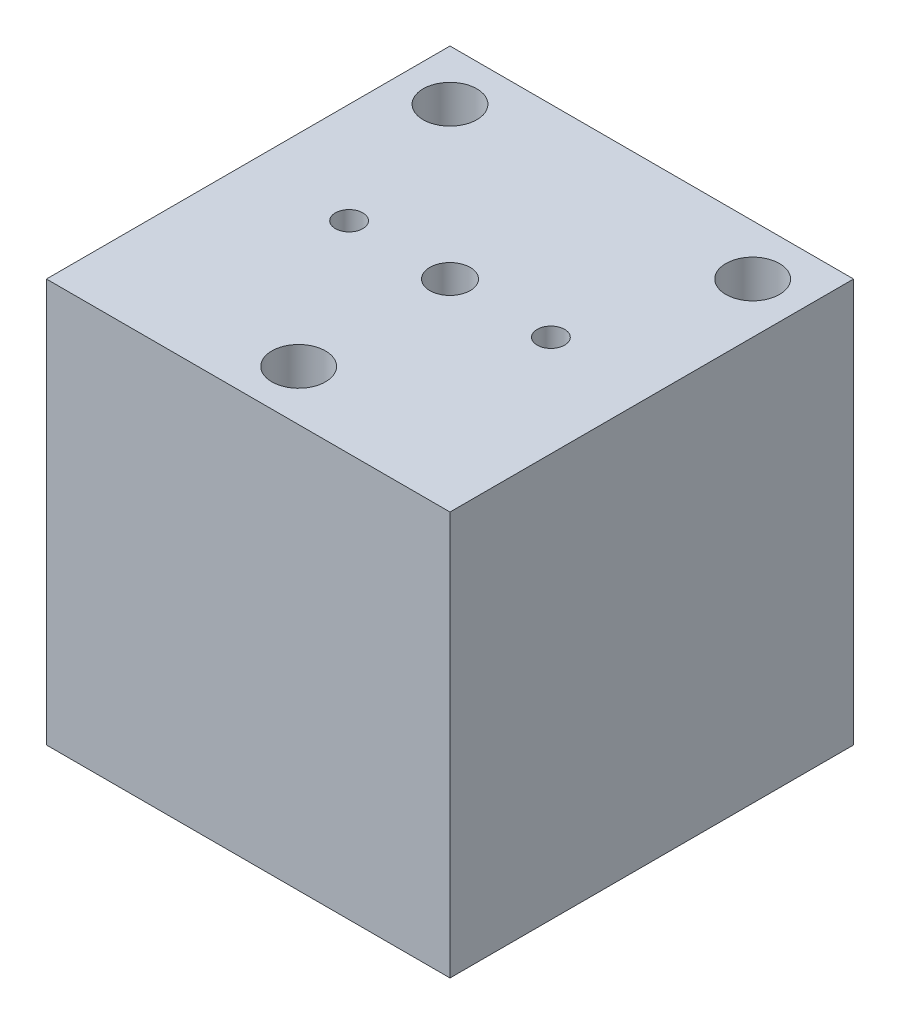
ISO-10303-21;
HEADER;
FILE_DESCRIPTION(('STEP AP214'),'2;1');
FILE_NAME('part.step','',(''),(''),'','','');
FILE_SCHEMA(('AUTOMOTIVE_DESIGN { 1 0 10303 214 1 1 1 1 }'));
ENDSEC;
DATA;
#1=APPLICATION_CONTEXT('core data for automotive mechanical design processes');
#2=APPLICATION_PROTOCOL_DEFINITION('international standard','automotive_design',2000,#1);
#3=PRODUCT_CONTEXT('',#1,'mechanical');
#4=PRODUCT('Part','Part','',(#3));
#5=PRODUCT_RELATED_PRODUCT_CATEGORY('part','',(#4));
#6=PRODUCT_DEFINITION_FORMATION('','',#4);
#7=PRODUCT_DEFINITION_CONTEXT('part definition',#1,'design');
#8=PRODUCT_DEFINITION('design','',#6,#7);
#9=PRODUCT_DEFINITION_SHAPE('','',#8);
#10=(LENGTH_UNIT() NAMED_UNIT(*) SI_UNIT(.MILLI.,.METRE.));
#11=(NAMED_UNIT(*) PLANE_ANGLE_UNIT() SI_UNIT($,.RADIAN.));
#12=(NAMED_UNIT(*) SI_UNIT($,.STERADIAN.) SOLID_ANGLE_UNIT());
#13=UNCERTAINTY_MEASURE_WITH_UNIT(LENGTH_MEASURE(1.E-05),#10,'distance_accuracy_value','');
#14=(GEOMETRIC_REPRESENTATION_CONTEXT(3) GLOBAL_UNCERTAINTY_ASSIGNED_CONTEXT((#13)) GLOBAL_UNIT_ASSIGNED_CONTEXT((#10,
#11,#12)) REPRESENTATION_CONTEXT('',''));
#15=CARTESIAN_POINT('',(0.,0.,0.));
#16=DIRECTION('',(0.,0.,1.));
#17=DIRECTION('',(1.,0.,0.));
#18=AXIS2_PLACEMENT_3D('',#15,#16,#17);
#19=CARTESIAN_POINT('',(-25.4,50.8,-25.4));
#20=DIRECTION('',(1.,0.,0.));
#21=DIRECTION('',(0.,0.,-1.));
#22=AXIS2_PLACEMENT_3D('',#19,#20,#21);
#23=PLANE('',#22);
#24=DIRECTION('',(0.,0.,1.));
#25=VECTOR('',#24,1.);
#26=CARTESIAN_POINT('',(-25.4,0.,-25.4));
#27=LINE('',#26,#25);
#28=CARTESIAN_POINT('',(-25.4,0.,-25.4));
#29=VERTEX_POINT('',#28);
#30=CARTESIAN_POINT('',(-25.4,0.,25.4));
#31=VERTEX_POINT('',#30);
#32=EDGE_CURVE('E133',#29,#31,#27,.T.);
#33=ORIENTED_EDGE('',*,*,#32,.T.);
#34=DIRECTION('',(0.,-1.,0.));
#35=VECTOR('',#34,1.);
#36=CARTESIAN_POINT('',(-25.4,50.8,25.4));
#37=LINE('',#36,#35);
#38=CARTESIAN_POINT('',(-25.4,50.8,25.4));
#39=VERTEX_POINT('',#38);
#40=EDGE_CURVE('E11',#39,#31,#37,.T.);
#41=ORIENTED_EDGE('',*,*,#40,.F.);
#42=DIRECTION('',(0.,0.,1.));
#43=VECTOR('',#42,1.);
#44=CARTESIAN_POINT('',(-25.4,50.8,-25.4));
#45=LINE('',#44,#43);
#46=CARTESIAN_POINT('',(-25.4,50.8,-25.4));
#47=VERTEX_POINT('',#46);
#48=EDGE_CURVE('E134',#47,#39,#45,.T.);
#49=ORIENTED_EDGE('',*,*,#48,.F.);
#50=DIRECTION('',(0.,-1.,0.));
#51=VECTOR('',#50,1.);
#52=CARTESIAN_POINT('',(-25.4,50.8,-25.4));
#53=LINE('',#52,#51);
#54=EDGE_CURVE('E140',#47,#29,#53,.T.);
#55=ORIENTED_EDGE('',*,*,#54,.T.);
#56=EDGE_LOOP('',(#33,#41,#49,#55));
#57=FACE_BOUND('',#56,.T.);
#58=ADVANCED_FACE('F34',(#57),#23,.F.);
#59=CARTESIAN_POINT('',(-25.4,50.8,25.4));
#60=DIRECTION('',(0.,0.,-1.));
#61=DIRECTION('',(-1.,0.,0.));
#62=AXIS2_PLACEMENT_3D('',#59,#60,#61);
#63=PLANE('',#62);
#64=DIRECTION('',(1.,0.,0.));
#65=VECTOR('',#64,1.);
#66=CARTESIAN_POINT('',(-25.4,0.,25.4));
#67=LINE('',#66,#65);
#68=CARTESIAN_POINT('',(25.4,0.,25.4));
#69=VERTEX_POINT('',#68);
#70=EDGE_CURVE('E143',#31,#69,#67,.T.);
#71=ORIENTED_EDGE('',*,*,#70,.T.);
#72=DIRECTION('',(0.,-1.,0.));
#73=VECTOR('',#72,1.);
#74=CARTESIAN_POINT('',(25.4,50.8,25.4));
#75=LINE('',#74,#73);
#76=CARTESIAN_POINT('',(25.4,50.8,25.4));
#77=VERTEX_POINT('',#76);
#78=EDGE_CURVE('E42',#77,#69,#75,.T.);
#79=ORIENTED_EDGE('',*,*,#78,.F.);
#80=DIRECTION('',(1.,0.,0.));
#81=VECTOR('',#80,1.);
#82=CARTESIAN_POINT('',(-25.4,50.8,25.4));
#83=LINE('',#82,#81);
#84=EDGE_CURVE('E81',#39,#77,#83,.T.);
#85=ORIENTED_EDGE('',*,*,#84,.F.);
#86=ORIENTED_EDGE('',*,*,#40,.T.);
#87=EDGE_LOOP('',(#71,#79,#85,#86));
#88=FACE_BOUND('',#87,.T.);
#89=ADVANCED_FACE('F167',(#88),#63,.F.);
#90=CARTESIAN_POINT('',(25.4,50.8,-25.4));
#91=DIRECTION('',(-1.,0.,0.));
#92=DIRECTION('',(0.,0.,1.));
#93=AXIS2_PLACEMENT_3D('',#90,#91,#92);
#94=PLANE('',#93);
#95=DIRECTION('',(0.,0.,-1.));
#96=VECTOR('',#95,1.);
#97=CARTESIAN_POINT('',(25.4,0.,-25.4));
#98=LINE('',#97,#96);
#99=CARTESIAN_POINT('',(25.4,0.,-25.4));
#100=VERTEX_POINT('',#99);
#101=EDGE_CURVE('E68',#69,#100,#98,.T.);
#102=ORIENTED_EDGE('',*,*,#101,.T.);
#103=DIRECTION('',(0.,-1.,0.));
#104=VECTOR('',#103,1.);
#105=CARTESIAN_POINT('',(25.4,50.8,-25.4));
#106=LINE('',#105,#104);
#107=CARTESIAN_POINT('',(25.4,50.8,-25.4));
#108=VERTEX_POINT('',#107);
#109=EDGE_CURVE('E148',#108,#100,#106,.T.);
#110=ORIENTED_EDGE('',*,*,#109,.F.);
#111=DIRECTION('',(0.,0.,-1.));
#112=VECTOR('',#111,1.);
#113=CARTESIAN_POINT('',(25.4,50.8,-25.4));
#114=LINE('',#113,#112);
#115=EDGE_CURVE('E137',#77,#108,#114,.T.);
#116=ORIENTED_EDGE('',*,*,#115,.F.);
#117=ORIENTED_EDGE('',*,*,#78,.T.);
#118=EDGE_LOOP('',(#102,#110,#116,#117));
#119=FACE_BOUND('',#118,.T.);
#120=ADVANCED_FACE('F150',(#119),#94,.F.);
#121=CARTESIAN_POINT('',(-25.4,50.8,-25.4));
#122=DIRECTION('',(0.,0.,1.));
#123=DIRECTION('',(1.,0.,0.));
#124=AXIS2_PLACEMENT_3D('',#121,#122,#123);
#125=PLANE('',#124);
#126=DIRECTION('',(-1.,0.,0.));
#127=VECTOR('',#126,1.);
#128=CARTESIAN_POINT('',(-25.4,0.,-25.4));
#129=LINE('',#128,#127);
#130=EDGE_CURVE('E74',#100,#29,#129,.T.);
#131=ORIENTED_EDGE('',*,*,#130,.T.);
#132=ORIENTED_EDGE('',*,*,#54,.F.);
#133=DIRECTION('',(-1.,0.,0.));
#134=VECTOR('',#133,1.);
#135=CARTESIAN_POINT('',(-25.4,50.8,-25.4));
#136=LINE('',#135,#134);
#137=EDGE_CURVE('E50',#108,#47,#136,.T.);
#138=ORIENTED_EDGE('',*,*,#137,.F.);
#139=ORIENTED_EDGE('',*,*,#109,.T.);
#140=EDGE_LOOP('',(#131,#132,#138,#139));
#141=FACE_BOUND('',#140,.T.);
#142=ADVANCED_FACE('F157',(#141),#125,.F.);
#143=CARTESIAN_POINT('',(0.,50.8,0.));
#144=DIRECTION('',(0.,1.,0.));
#145=DIRECTION('',(0.,0.,1.));
#146=AXIS2_PLACEMENT_3D('',#143,#144,#145);
#147=PLANE('',#146);
#148=CARTESIAN_POINT('',(-12.7,50.8,0.));
#149=DIRECTION('',(0.,1.,0.));
#150=DIRECTION('',(0.,0.,1.));
#151=AXIS2_PLACEMENT_3D('',#148,#149,#150);
#152=CIRCLE('',#151,1.72719999999999);
#153=CARTESIAN_POINT('',(-12.7,50.8,1.72719999999999));
#154=VERTEX_POINT('',#153);
#155=EDGE_CURVE('E99',#154,#154,#152,.T.);
#156=ORIENTED_EDGE('',*,*,#155,.F.);
#157=EDGE_LOOP('',(#156));
#158=FACE_BOUND('',#157,.T.);
#159=CARTESIAN_POINT('',(12.7,50.8,0.));
#160=DIRECTION('',(0.,1.,0.));
#161=DIRECTION('',(0.,0.,1.));
#162=AXIS2_PLACEMENT_3D('',#159,#160,#161);
#163=CIRCLE('',#162,1.72719999999999);
#164=CARTESIAN_POINT('',(12.7,50.8,1.72719999999999));
#165=VERTEX_POINT('',#164);
#166=EDGE_CURVE('E98',#165,#165,#163,.T.);
#167=ORIENTED_EDGE('',*,*,#166,.F.);
#168=EDGE_LOOP('',(#167));
#169=FACE_BOUND('',#168,.T.);
#170=CARTESIAN_POINT('',(0.,50.8,0.));
#171=DIRECTION('',(0.,1.,0.));
#172=DIRECTION('',(0.,0.,1.));
#173=AXIS2_PLACEMENT_3D('',#170,#171,#172);
#174=CIRCLE('',#173,2.54);
#175=CARTESIAN_POINT('',(0.,50.8,2.54));
#176=VERTEX_POINT('',#175);
#177=EDGE_CURVE('E109',#176,#176,#174,.T.);
#178=ORIENTED_EDGE('',*,*,#177,.F.);
#179=EDGE_LOOP('',(#178));
#180=FACE_BOUND('',#179,.T.);
#181=CARTESIAN_POINT('',(-19.05,50.8,-19.05));
#182=DIRECTION('',(0.,1.,0.));
#183=DIRECTION('',(0.,0.,1.));
#184=AXIS2_PLACEMENT_3D('',#181,#182,#183);
#185=CIRCLE('',#184,3.3782);
#186=CARTESIAN_POINT('',(-19.05,50.8,-15.6718));
#187=VERTEX_POINT('',#186);
#188=EDGE_CURVE('E113',#187,#187,#185,.T.);
#189=ORIENTED_EDGE('',*,*,#188,.F.);
#190=EDGE_LOOP('',(#189));
#191=FACE_BOUND('',#190,.T.);
#192=CARTESIAN_POINT('',(19.05,50.8,-19.05));
#193=DIRECTION('',(0.,1.,0.));
#194=DIRECTION('',(0.,0.,1.));
#195=AXIS2_PLACEMENT_3D('',#192,#193,#194);
#196=CIRCLE('',#195,3.3782);
#197=CARTESIAN_POINT('',(19.05,50.8,-15.6718));
#198=VERTEX_POINT('',#197);
#199=EDGE_CURVE('E121',#198,#198,#196,.T.);
#200=ORIENTED_EDGE('',*,*,#199,.F.);
#201=EDGE_LOOP('',(#200));
#202=FACE_BOUND('',#201,.T.);
#203=CARTESIAN_POINT('',(0.,50.8,19.05));
#204=DIRECTION('',(0.,1.,0.));
#205=DIRECTION('',(0.,0.,1.));
#206=AXIS2_PLACEMENT_3D('',#203,#204,#205);
#207=CIRCLE('',#206,3.3782);
#208=CARTESIAN_POINT('',(0.,50.8,22.4282));
#209=VERTEX_POINT('',#208);
#210=EDGE_CURVE('E127',#209,#209,#207,.T.);
#211=ORIENTED_EDGE('',*,*,#210,.F.);
#212=EDGE_LOOP('',(#211));
#213=FACE_BOUND('',#212,.T.);
#214=ORIENTED_EDGE('',*,*,#48,.T.);
#215=ORIENTED_EDGE('',*,*,#84,.T.);
#216=ORIENTED_EDGE('',*,*,#115,.T.);
#217=ORIENTED_EDGE('',*,*,#137,.T.);
#218=EDGE_LOOP('',(#214,#215,#216,#217));
#219=FACE_BOUND('',#218,.T.);
#220=ADVANCED_FACE('F159',(#158,#169,#180,#191,#202,#213,#219),#147,.T.);
#221=CARTESIAN_POINT('',(0.,0.,0.));
#222=DIRECTION('',(0.,1.,0.));
#223=DIRECTION('',(0.,0.,1.));
#224=AXIS2_PLACEMENT_3D('',#221,#222,#223);
#225=PLANE('',#224);
#226=CARTESIAN_POINT('',(0.,0.,0.));
#227=DIRECTION('',(0.,1.,0.));
#228=DIRECTION('',(0.,0.,1.));
#229=AXIS2_PLACEMENT_3D('',#226,#227,#228);
#230=CIRCLE('',#229,2.54);
#231=CARTESIAN_POINT('',(0.,0.,2.54));
#232=VERTEX_POINT('',#231);
#233=EDGE_CURVE('E110',#232,#232,#230,.T.);
#234=ORIENTED_EDGE('',*,*,#233,.T.);
#235=EDGE_LOOP('',(#234));
#236=FACE_BOUND('',#235,.T.);
#237=CARTESIAN_POINT('',(-19.05,0.,-19.05));
#238=DIRECTION('',(0.,1.,0.));
#239=DIRECTION('',(0.,0.,1.));
#240=AXIS2_PLACEMENT_3D('',#237,#238,#239);
#241=CIRCLE('',#240,3.37819999999999);
#242=CARTESIAN_POINT('',(-19.05,0.,-15.6718));
#243=VERTEX_POINT('',#242);
#244=EDGE_CURVE('E118',#243,#243,#241,.T.);
#245=ORIENTED_EDGE('',*,*,#244,.T.);
#246=EDGE_LOOP('',(#245));
#247=FACE_BOUND('',#246,.T.);
#248=CARTESIAN_POINT('',(19.05,0.,-19.05));
#249=DIRECTION('',(0.,1.,0.));
#250=DIRECTION('',(0.,0.,1.));
#251=AXIS2_PLACEMENT_3D('',#248,#249,#250);
#252=CIRCLE('',#251,3.37819999999999);
#253=CARTESIAN_POINT('',(19.05,0.,-15.6718));
#254=VERTEX_POINT('',#253);
#255=EDGE_CURVE('E124',#254,#254,#252,.T.);
#256=ORIENTED_EDGE('',*,*,#255,.T.);
#257=EDGE_LOOP('',(#256));
#258=FACE_BOUND('',#257,.T.);
#259=CARTESIAN_POINT('',(0.,0.,19.05));
#260=DIRECTION('',(0.,1.,0.));
#261=DIRECTION('',(0.,0.,1.));
#262=AXIS2_PLACEMENT_3D('',#259,#260,#261);
#263=CIRCLE('',#262,3.37819999999999);
#264=CARTESIAN_POINT('',(0.,0.,22.4282));
#265=VERTEX_POINT('',#264);
#266=EDGE_CURVE('E130',#265,#265,#263,.T.);
#267=ORIENTED_EDGE('',*,*,#266,.T.);
#268=EDGE_LOOP('',(#267));
#269=FACE_BOUND('',#268,.T.);
#270=ORIENTED_EDGE('',*,*,#32,.F.);
#271=ORIENTED_EDGE('',*,*,#130,.F.);
#272=ORIENTED_EDGE('',*,*,#101,.F.);
#273=ORIENTED_EDGE('',*,*,#70,.F.);
#274=EDGE_LOOP('',(#270,#271,#272,#273));
#275=FACE_BOUND('',#274,.T.);
#276=ADVANCED_FACE('F153',(#236,#247,#258,#269,#275),#225,.F.);
#277=CARTESIAN_POINT('',(0.,50.8,19.05));
#278=DIRECTION('',(0.,1.,0.));
#279=DIRECTION('',(0.,0.,1.));
#280=AXIS2_PLACEMENT_3D('',#277,#278,#279);
#281=CYLINDRICAL_SURFACE('',#280,3.3782);
#282=ORIENTED_EDGE('',*,*,#266,.F.);
#283=EDGE_LOOP('',(#282));
#284=FACE_BOUND('',#283,.T.);
#285=ORIENTED_EDGE('',*,*,#210,.T.);
#286=EDGE_LOOP('',(#285));
#287=FACE_BOUND('',#286,.T.);
#288=ADVANCED_FACE('F190',(#284,#287),#281,.F.);
#289=CARTESIAN_POINT('',(19.05,50.8,-19.05));
#290=DIRECTION('',(0.,1.,0.));
#291=DIRECTION('',(0.,0.,1.));
#292=AXIS2_PLACEMENT_3D('',#289,#290,#291);
#293=CYLINDRICAL_SURFACE('',#292,3.3782);
#294=ORIENTED_EDGE('',*,*,#255,.F.);
#295=EDGE_LOOP('',(#294));
#296=FACE_BOUND('',#295,.T.);
#297=ORIENTED_EDGE('',*,*,#199,.T.);
#298=EDGE_LOOP('',(#297));
#299=FACE_BOUND('',#298,.T.);
#300=ADVANCED_FACE('F195',(#296,#299),#293,.F.);
#301=CARTESIAN_POINT('',(-19.05,50.8,-19.05));
#302=DIRECTION('',(0.,1.,0.));
#303=DIRECTION('',(0.,0.,1.));
#304=AXIS2_PLACEMENT_3D('',#301,#302,#303);
#305=CYLINDRICAL_SURFACE('',#304,3.3782);
#306=ORIENTED_EDGE('',*,*,#244,.F.);
#307=EDGE_LOOP('',(#306));
#308=FACE_BOUND('',#307,.T.);
#309=ORIENTED_EDGE('',*,*,#188,.T.);
#310=EDGE_LOOP('',(#309));
#311=FACE_BOUND('',#310,.T.);
#312=ADVANCED_FACE('F207',(#308,#311),#305,.F.);
#313=CARTESIAN_POINT('',(0.,0.,0.));
#314=DIRECTION('',(0.,1.,0.));
#315=DIRECTION('',(0.,0.,1.));
#316=AXIS2_PLACEMENT_3D('',#313,#314,#315);
#317=CYLINDRICAL_SURFACE('',#316,2.54);
#318=ORIENTED_EDGE('',*,*,#233,.F.);
#319=EDGE_LOOP('',(#318));
#320=FACE_BOUND('',#319,.T.);
#321=ORIENTED_EDGE('',*,*,#177,.T.);
#322=EDGE_LOOP('',(#321));
#323=FACE_BOUND('',#322,.T.);
#324=ADVANCED_FACE('F217',(#320,#323),#317,.F.);
#325=CARTESIAN_POINT('',(12.7,38.1,0.));
#326=DIRECTION('',(0.,1.,0.));
#327=DIRECTION('',(0.,0.,1.));
#328=AXIS2_PLACEMENT_3D('',#325,#326,#327);
#329=CONICAL_SURFACE('',#328,1.7272,1.02974425867665);
#330=CARTESIAN_POINT('',(12.7,37.0621935388156,0.));
#331=VERTEX_POINT('',#330);
#332=VERTEX_LOOP('',#331);
#333=FACE_BOUND('',#332,.T.);
#334=CARTESIAN_POINT('',(12.7,38.1,0.));
#335=DIRECTION('',(0.,1.,0.));
#336=DIRECTION('',(0.,0.,1.));
#337=AXIS2_PLACEMENT_3D('',#334,#335,#336);
#338=CIRCLE('',#337,1.7272);
#339=CARTESIAN_POINT('',(12.7,38.1,1.7272));
#340=VERTEX_POINT('',#339);
#341=EDGE_CURVE('E102',#340,#340,#338,.T.);
#342=ORIENTED_EDGE('',*,*,#341,.T.);
#343=EDGE_LOOP('',(#342));
#344=FACE_BOUND('',#343,.T.);
#345=ADVANCED_FACE('F233',(#333,#344),#329,.F.);
#346=CARTESIAN_POINT('',(12.7,50.8,0.));
#347=DIRECTION('',(0.,1.,0.));
#348=DIRECTION('',(0.,0.,1.));
#349=AXIS2_PLACEMENT_3D('',#346,#347,#348);
#350=CYLINDRICAL_SURFACE('',#349,1.72719999999999);
#351=ORIENTED_EDGE('',*,*,#341,.F.);
#352=EDGE_LOOP('',(#351));
#353=FACE_BOUND('',#352,.T.);
#354=ORIENTED_EDGE('',*,*,#166,.T.);
#355=EDGE_LOOP('',(#354));
#356=FACE_BOUND('',#355,.T.);
#357=ADVANCED_FACE('F92',(#353,#356),#350,.F.);
#358=CARTESIAN_POINT('',(-12.7,38.1,0.));
#359=DIRECTION('',(0.,1.,0.));
#360=DIRECTION('',(0.,0.,1.));
#361=AXIS2_PLACEMENT_3D('',#358,#359,#360);
#362=CONICAL_SURFACE('',#361,1.7272,1.02974425867665);
#363=CARTESIAN_POINT('',(-12.7,37.0621935388156,0.));
#364=VERTEX_POINT('',#363);
#365=VERTEX_LOOP('',#364);
#366=FACE_BOUND('',#365,.T.);
#367=CARTESIAN_POINT('',(-12.7,38.1,0.));
#368=DIRECTION('',(0.,1.,0.));
#369=DIRECTION('',(0.,0.,1.));
#370=AXIS2_PLACEMENT_3D('',#367,#368,#369);
#371=CIRCLE('',#370,1.7272);
#372=CARTESIAN_POINT('',(-12.7,38.1,1.7272));
#373=VERTEX_POINT('',#372);
#374=EDGE_CURVE('E96',#373,#373,#371,.T.);
#375=ORIENTED_EDGE('',*,*,#374,.T.);
#376=EDGE_LOOP('',(#375));
#377=FACE_BOUND('',#376,.T.);
#378=ADVANCED_FACE('F88',(#366,#377),#362,.F.);
#379=CARTESIAN_POINT('',(-12.7,50.8,0.));
#380=DIRECTION('',(0.,1.,0.));
#381=DIRECTION('',(0.,0.,1.));
#382=AXIS2_PLACEMENT_3D('',#379,#380,#381);
#383=CYLINDRICAL_SURFACE('',#382,1.72719999999999);
#384=ORIENTED_EDGE('',*,*,#374,.F.);
#385=EDGE_LOOP('',(#384));
#386=FACE_BOUND('',#385,.T.);
#387=ORIENTED_EDGE('',*,*,#155,.T.);
#388=EDGE_LOOP('',(#387));
#389=FACE_BOUND('',#388,.T.);
#390=ADVANCED_FACE('F91',(#386,#389),#383,.F.);
#391=CLOSED_SHELL('',(#58,#89,#120,#142,#220,#276,#288,#300,#312,#324,#345,#357,#378,#390));
#392=MANIFOLD_SOLID_BREP('B2',#391);
#393=ADVANCED_BREP_SHAPE_REPRESENTATION('',(#18,#392),#14);
#394=SHAPE_DEFINITION_REPRESENTATION(#9,#393);
ENDSEC;
END-ISO-10303-21;
